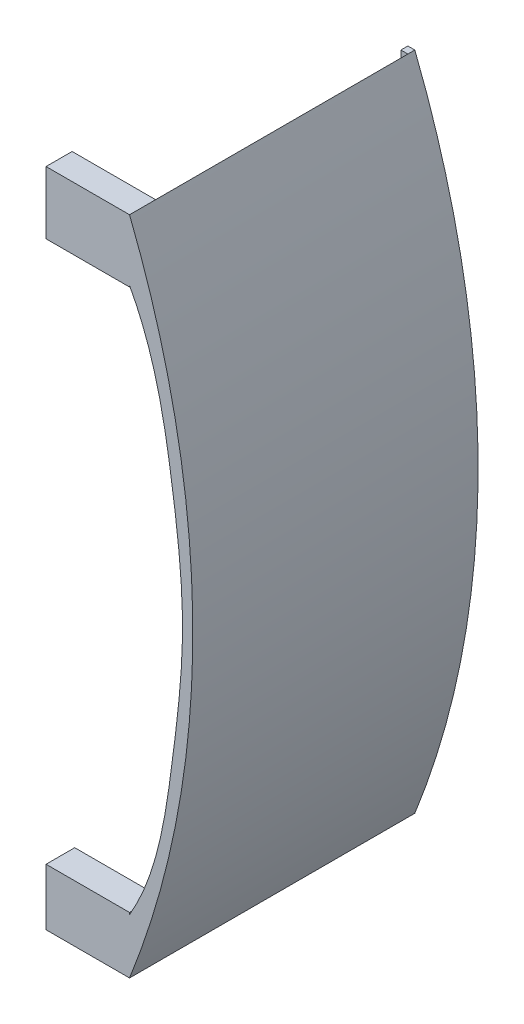
ISO-10303-21;
HEADER;
FILE_DESCRIPTION(('STEP AP214'),'2;1');
FILE_NAME('part.step','',(''),(''),'','','');
FILE_SCHEMA(('AUTOMOTIVE_DESIGN { 1 0 10303 214 1 1 1 1 }'));
ENDSEC;
DATA;
#1=APPLICATION_CONTEXT('core data for automotive mechanical design processes');
#2=APPLICATION_PROTOCOL_DEFINITION('international standard','automotive_design',2000,#1);
#3=PRODUCT_CONTEXT('',#1,'mechanical');
#4=PRODUCT('Part','Part','',(#3));
#5=PRODUCT_RELATED_PRODUCT_CATEGORY('part','',(#4));
#6=PRODUCT_DEFINITION_FORMATION('','',#4);
#7=PRODUCT_DEFINITION_CONTEXT('part definition',#1,'design');
#8=PRODUCT_DEFINITION('design','',#6,#7);
#9=PRODUCT_DEFINITION_SHAPE('','',#8);
#10=(LENGTH_UNIT() NAMED_UNIT(*) SI_UNIT(.MILLI.,.METRE.));
#11=(NAMED_UNIT(*) PLANE_ANGLE_UNIT() SI_UNIT($,.RADIAN.));
#12=(NAMED_UNIT(*) SI_UNIT($,.STERADIAN.) SOLID_ANGLE_UNIT());
#13=UNCERTAINTY_MEASURE_WITH_UNIT(LENGTH_MEASURE(1.E-05),#10,'distance_accuracy_value','');
#14=(GEOMETRIC_REPRESENTATION_CONTEXT(3) GLOBAL_UNCERTAINTY_ASSIGNED_CONTEXT((#13)) GLOBAL_UNIT_ASSIGNED_CONTEXT((#10,
#11,#12)) REPRESENTATION_CONTEXT('',''));
#15=CARTESIAN_POINT('',(0.,0.,0.));
#16=DIRECTION('',(0.,0.,1.));
#17=DIRECTION('',(1.,0.,0.));
#18=AXIS2_PLACEMENT_3D('',#15,#16,#17);
#19=CARTESIAN_POINT('',(0.,-95.,41.));
#20=DIRECTION('',(1.,0.,0.));
#21=DIRECTION('',(0.,1.,0.));
#22=AXIS2_PLACEMENT_3D('',#19,#20,#21);
#23=PLANE('',#22);
#24=DIRECTION('',(0.,1.,0.));
#25=VECTOR('',#24,1.);
#26=CARTESIAN_POINT('',(0.,95.,-39.));
#27=LINE('',#26,#25);
#28=CARTESIAN_POINT('',(0.,77.403954957847,-39.));
#29=VERTEX_POINT('',#28);
#30=CARTESIAN_POINT('',(0.,95.,-39.));
#31=VERTEX_POINT('',#30);
#32=EDGE_CURVE('E57',#29,#31,#27,.T.);
#33=ORIENTED_EDGE('',*,*,#32,.F.);
#34=DIRECTION('',(0.,0.,1.));
#35=VECTOR('',#34,1.);
#36=CARTESIAN_POINT('',(0.,77.403954957847,-41.));
#37=LINE('',#36,#35);
#38=CARTESIAN_POINT('',(0.,77.403954957847,33.5080196550556));
#39=VERTEX_POINT('',#38);
#40=EDGE_CURVE('E180',#29,#39,#37,.T.);
#41=ORIENTED_EDGE('',*,*,#40,.T.);
#42=DIRECTION('',(0.,-1.,0.));
#43=VECTOR('',#42,1.);
#44=CARTESIAN_POINT('',(0.,95.,33.5080196550556));
#45=LINE('',#44,#43);
#46=CARTESIAN_POINT('',(0.,95.,33.5080196550556));
#47=VERTEX_POINT('',#46);
#48=EDGE_CURVE('E334',#47,#39,#45,.T.);
#49=ORIENTED_EDGE('',*,*,#48,.F.);
#50=DIRECTION('',(0.,0.,-1.));
#51=VECTOR('',#50,1.);
#52=CARTESIAN_POINT('',(0.,95.,41.));
#53=LINE('',#52,#51);
#54=EDGE_CURVE('E42',#47,#31,#53,.T.);
#55=ORIENTED_EDGE('',*,*,#54,.T.);
#56=EDGE_LOOP('',(#33,#41,#49,#55));
#57=FACE_BOUND('',#56,.T.);
#58=ADVANCED_FACE('F34',(#57),#23,.F.);
#59=DIRECTION('',(0.,-1.,0.));
#60=VECTOR('',#59,1.);
#61=CARTESIAN_POINT('',(0.,-95.,32.7580196550556));
#62=LINE('',#61,#60);
#63=CARTESIAN_POINT('',(0.,-79.2331527558384,32.7580196550556));
#64=VERTEX_POINT('',#63);
#65=CARTESIAN_POINT('',(0.,-95.,32.7580196550556));
#66=VERTEX_POINT('',#65);
#67=EDGE_CURVE('E299',#64,#66,#62,.T.);
#68=ORIENTED_EDGE('',*,*,#67,.F.);
#69=DIRECTION('',(0.,0.,1.));
#70=VECTOR('',#69,1.);
#71=CARTESIAN_POINT('',(0.,-79.2331527558384,-41.));
#72=LINE('',#71,#70);
#73=CARTESIAN_POINT('',(0.,-79.2331527558384,-39.));
#74=VERTEX_POINT('',#73);
#75=EDGE_CURVE('E302',#74,#64,#72,.T.);
#76=ORIENTED_EDGE('',*,*,#75,.F.);
#77=DIRECTION('',(0.,1.,0.));
#78=VECTOR('',#77,1.);
#79=CARTESIAN_POINT('',(0.,-95.,-39.));
#80=LINE('',#79,#78);
#81=CARTESIAN_POINT('',(0.,-95.,-39.));
#82=VERTEX_POINT('',#81);
#83=EDGE_CURVE('E415',#82,#74,#80,.T.);
#84=ORIENTED_EDGE('',*,*,#83,.F.);
#85=DIRECTION('',(0.,0.,-1.));
#86=VECTOR('',#85,1.);
#87=CARTESIAN_POINT('',(0.,-95.,41.));
#88=LINE('',#87,#86);
#89=EDGE_CURVE('E305',#66,#82,#88,.T.);
#90=ORIENTED_EDGE('',*,*,#89,.F.);
#91=EDGE_LOOP('',(#68,#76,#84,#90));
#92=FACE_BOUND('',#91,.T.);
#93=ADVANCED_FACE('F287',(#92),#23,.F.);
#94=CARTESIAN_POINT('',(-238.988345174706,0.,41.));
#95=DIRECTION('',(0.,0.,-1.));
#96=DIRECTION('',(-1.,0.,0.));
#97=AXIS2_PLACEMENT_3D('',#94,#95,#96);
#98=CYLINDRICAL_SURFACE('',#97,257.177816168783);
#99=CARTESIAN_POINT('',(-238.988345174706,0.,-41.));
#100=DIRECTION('',(0.,0.,1.));
#101=DIRECTION('',(-1.,0.,0.));
#102=AXIS2_PLACEMENT_3D('',#99,#100,#101);
#103=CIRCLE('',#102,257.177816168783);
#104=CARTESIAN_POINT('',(0.,-95.,-41.));
#105=VERTEX_POINT('',#104);
#106=CARTESIAN_POINT('',(0.,95.,-41.));
#107=VERTEX_POINT('',#106);
#108=EDGE_CURVE('E359',#105,#107,#103,.T.);
#109=ORIENTED_EDGE('',*,*,#108,.T.);
#110=DIRECTION('',(0.,0.,-1.));
#111=VECTOR('',#110,1.);
#112=CARTESIAN_POINT('',(0.,95.,-39.));
#113=LINE('',#112,#111);
#114=EDGE_CURVE('E392',#31,#107,#113,.T.);
#115=ORIENTED_EDGE('',*,*,#114,.F.);
#116=ORIENTED_EDGE('',*,*,#54,.F.);
#117=CARTESIAN_POINT('',(0.,95.,41.));
#118=VERTEX_POINT('',#117);
#119=EDGE_CURVE('E11',#118,#47,#53,.T.);
#120=ORIENTED_EDGE('',*,*,#119,.F.);
#121=CARTESIAN_POINT('',(-238.988345174706,0.,41.));
#122=DIRECTION('',(0.,0.,1.));
#123=DIRECTION('',(-1.,0.,0.));
#124=AXIS2_PLACEMENT_3D('',#121,#122,#123);
#125=CIRCLE('',#124,257.177816168783);
#126=CARTESIAN_POINT('',(0.,-95.,41.));
#127=VERTEX_POINT('',#126);
#128=EDGE_CURVE('E362',#127,#118,#125,.T.);
#129=ORIENTED_EDGE('',*,*,#128,.F.);
#130=EDGE_CURVE('E365',#127,#66,#88,.T.);
#131=ORIENTED_EDGE('',*,*,#130,.T.);
#132=ORIENTED_EDGE('',*,*,#89,.T.);
#133=DIRECTION('',(0.,0.,-1.));
#134=VECTOR('',#133,1.);
#135=CARTESIAN_POINT('',(0.,-95.,-39.));
#136=LINE('',#135,#134);
#137=EDGE_CURVE('E371',#82,#105,#136,.T.);
#138=ORIENTED_EDGE('',*,*,#137,.T.);
#139=EDGE_LOOP('',(#109,#115,#116,#120,#129,#131,#132,#138));
#140=FACE_BOUND('',#139,.T.);
#141=ADVANCED_FACE('F36',(#140),#98,.T.);
#142=CARTESIAN_POINT('',(-238.988345174706,0.,41.));
#143=DIRECTION('',(0.,0.,-1.));
#144=DIRECTION('',(-1.,0.,0.));
#145=AXIS2_PLACEMENT_3D('',#142,#143,#144);
#146=PLANE('',#145);
#147=CARTESIAN_POINT('',(0.,-79.2331527558384,41.));
#148=CARTESIAN_POINT('',(8.09473103737131,-65.4560845804218,41.));
#149=CARTESIAN_POINT('',(12.0147305910402,-38.3103847513682,41.));
#150=CARTESIAN_POINT('',(16.5809048340559,-0.0417572838327915,41.));
#151=CARTESIAN_POINT('',(12.0698818166097,37.679146823226,41.));
#152=CARTESIAN_POINT('',(7.29967651003466,63.9991056083044,41.));
#153=CARTESIAN_POINT('',(0.,77.403954957847,41.));
#154=B_SPLINE_CURVE_WITH_KNOTS('',3,(#147,#148,#149,#150,#151,#152,#153),.UNSPECIFIED.,.F.,.F.,
(4,1,1,1,4),(0.,0.293310150467469,0.505853511654225,0.717729204315068,1.),.UNSPECIFIED.);
#155=CARTESIAN_POINT('',(0.,-79.2331527558384,41.));
#156=VERTEX_POINT('',#155);
#157=CARTESIAN_POINT('',(0.,77.403954957847,41.));
#158=VERTEX_POINT('',#157);
#159=EDGE_CURVE('E186',#156,#158,#154,.T.);
#160=ORIENTED_EDGE('',*,*,#159,.F.);
#161=DIRECTION('',(0.,-1.,0.));
#162=VECTOR('',#161,1.);
#163=CARTESIAN_POINT('',(0.,77.403954957847,41.));
#164=LINE('',#163,#162);
#165=CARTESIAN_POINT('',(0.,-78.6817419820309,41.));
#166=VERTEX_POINT('',#165);
#167=EDGE_CURVE('E192',#166,#156,#164,.T.);
#168=ORIENTED_EDGE('',*,*,#167,.F.);
#169=DIRECTION('',(1.,0.,0.));
#170=VECTOR('',#169,1.);
#171=CARTESIAN_POINT('',(-24.,-78.6817419820309,41.));
#172=LINE('',#171,#170);
#173=CARTESIAN_POINT('',(-24.,-78.6817419820309,41.));
#174=VERTEX_POINT('',#173);
#175=EDGE_CURVE('E331',#174,#166,#172,.T.);
#176=ORIENTED_EDGE('',*,*,#175,.F.);
#177=DIRECTION('',(0.,1.,0.));
#178=VECTOR('',#177,1.);
#179=CARTESIAN_POINT('',(-24.,-95.,41.));
#180=LINE('',#179,#178);
#181=CARTESIAN_POINT('',(-24.,-95.,41.));
#182=VERTEX_POINT('',#181);
#183=EDGE_CURVE('E318',#182,#174,#180,.T.);
#184=ORIENTED_EDGE('',*,*,#183,.F.);
#185=DIRECTION('',(1.,0.,0.));
#186=VECTOR('',#185,1.);
#187=CARTESIAN_POINT('',(-24.,-95.,41.));
#188=LINE('',#187,#186);
#189=EDGE_CURVE('E325',#182,#127,#188,.T.);
#190=ORIENTED_EDGE('',*,*,#189,.T.);
#191=ORIENTED_EDGE('',*,*,#128,.T.);
#192=DIRECTION('',(1.,0.,0.));
#193=VECTOR('',#192,1.);
#194=CARTESIAN_POINT('',(-24.,95.,41.));
#195=LINE('',#194,#193);
#196=CARTESIAN_POINT('',(-24.,95.,41.));
#197=VERTEX_POINT('',#196);
#198=EDGE_CURVE('E355',#197,#118,#195,.T.);
#199=ORIENTED_EDGE('',*,*,#198,.F.);
#200=DIRECTION('',(0.,1.,0.));
#201=VECTOR('',#200,1.);
#202=CARTESIAN_POINT('',(-24.,95.,41.));
#203=LINE('',#202,#201);
#204=CARTESIAN_POINT('',(-24.,77.,41.));
#205=VERTEX_POINT('',#204);
#206=EDGE_CURVE('E335',#205,#197,#203,.T.);
#207=ORIENTED_EDGE('',*,*,#206,.F.);
#208=DIRECTION('',(1.,0.,0.));
#209=VECTOR('',#208,1.);
#210=CARTESIAN_POINT('',(-24.,77.,41.));
#211=LINE('',#210,#209);
#212=CARTESIAN_POINT('',(0.,77.,41.));
#213=VERTEX_POINT('',#212);
#214=EDGE_CURVE('E197',#205,#213,#211,.T.);
#215=ORIENTED_EDGE('',*,*,#214,.T.);
#216=EDGE_CURVE('E174',#158,#213,#164,.T.);
#217=ORIENTED_EDGE('',*,*,#216,.F.);
#218=EDGE_LOOP('',(#160,#168,#176,#184,#190,#191,#199,#207,#215,#217));
#219=FACE_BOUND('',#218,.T.);
#220=ADVANCED_FACE('F194',(#219),#146,.F.);
#221=CARTESIAN_POINT('',(-238.988345174706,0.,-41.));
#222=DIRECTION('',(0.,0.,-1.));
#223=DIRECTION('',(-1.,0.,0.));
#224=AXIS2_PLACEMENT_3D('',#221,#222,#223);
#225=PLANE('',#224);
#226=DIRECTION('',(0.,-1.,0.));
#227=VECTOR('',#226,1.);
#228=CARTESIAN_POINT('',(0.,77.403954957847,-41.));
#229=LINE('',#228,#227);
#230=CARTESIAN_POINT('',(0.,-75.9354333613668,-41.));
#231=VERTEX_POINT('',#230);
#232=CARTESIAN_POINT('',(0.,-79.2331527558384,-41.));
#233=VERTEX_POINT('',#232);
#234=EDGE_CURVE('E202',#231,#233,#229,.T.);
#235=ORIENTED_EDGE('',*,*,#234,.T.);
#236=CARTESIAN_POINT('',(0.,-79.2331527558384,-41.));
#237=CARTESIAN_POINT('',(8.09473103737131,-65.4560845804218,-41.));
#238=CARTESIAN_POINT('',(12.0147305910402,-38.3103847513682,-41.));
#239=CARTESIAN_POINT('',(16.5809048340559,-0.0417572838327915,-41.));
#240=CARTESIAN_POINT('',(12.0698818166097,37.679146823226,-41.));
#241=CARTESIAN_POINT('',(7.29967651003466,63.9991056083044,-41.));
#242=CARTESIAN_POINT('',(0.,77.403954957847,-41.));
#243=B_SPLINE_CURVE_WITH_KNOTS('',3,(#236,#237,#238,#239,#240,#241,#242),.UNSPECIFIED.,.F.,.F.,
(4,1,1,1,4),(0.,0.293310150467469,0.505853511654225,0.717729204315068,1.),.UNSPECIFIED.);
#244=CARTESIAN_POINT('',(0.,77.403954957847,-41.));
#245=VERTEX_POINT('',#244);
#246=EDGE_CURVE('E199',#233,#245,#243,.T.);
#247=ORIENTED_EDGE('',*,*,#246,.T.);
#248=CARTESIAN_POINT('',(0.,73.1891247407023,-41.));
#249=VERTEX_POINT('',#248);
#250=EDGE_CURVE('E181',#245,#249,#229,.T.);
#251=ORIENTED_EDGE('',*,*,#250,.T.);
#252=DIRECTION('',(1.,0.,0.));
#253=VECTOR('',#252,1.);
#254=CARTESIAN_POINT('',(0.,73.1891247407023,-41.));
#255=LINE('',#254,#253);
#256=CARTESIAN_POINT('',(-2.00000000000003,73.1891247407023,-41.));
#257=VERTEX_POINT('',#256);
#258=EDGE_CURVE('E440',#257,#249,#255,.T.);
#259=ORIENTED_EDGE('',*,*,#258,.F.);
#260=DIRECTION('',(0.,-1.,0.));
#261=VECTOR('',#260,1.);
#262=CARTESIAN_POINT('',(-2.00000000000003,95.,-41.));
#263=LINE('',#262,#261);
#264=CARTESIAN_POINT('',(-2.00000000000003,95.,-41.));
#265=VERTEX_POINT('',#264);
#266=EDGE_CURVE('E386',#265,#257,#263,.T.);
#267=ORIENTED_EDGE('',*,*,#266,.F.);
#268=DIRECTION('',(-1.,0.,0.));
#269=VECTOR('',#268,1.);
#270=CARTESIAN_POINT('',(0.,95.,-41.));
#271=LINE('',#270,#269);
#272=EDGE_CURVE('E383',#107,#265,#271,.T.);
#273=ORIENTED_EDGE('',*,*,#272,.F.);
#274=ORIENTED_EDGE('',*,*,#108,.F.);
#275=DIRECTION('',(1.,0.,0.));
#276=VECTOR('',#275,1.);
#277=CARTESIAN_POINT('',(0.,-95.,-41.));
#278=LINE('',#277,#276);
#279=CARTESIAN_POINT('',(-2.,-95.,-41.));
#280=VERTEX_POINT('',#279);
#281=EDGE_CURVE('E381',#280,#105,#278,.T.);
#282=ORIENTED_EDGE('',*,*,#281,.F.);
#283=DIRECTION('',(0.,-1.,0.));
#284=VECTOR('',#283,1.);
#285=CARTESIAN_POINT('',(-2.,-95.,-41.));
#286=LINE('',#285,#284);
#287=CARTESIAN_POINT('',(-2.,-75.9354333613668,-41.));
#288=VERTEX_POINT('',#287);
#289=EDGE_CURVE('E424',#288,#280,#286,.T.);
#290=ORIENTED_EDGE('',*,*,#289,.F.);
#291=DIRECTION('',(-1.,0.,0.));
#292=VECTOR('',#291,1.);
#293=CARTESIAN_POINT('',(0.,-75.9354333613668,-41.));
#294=LINE('',#293,#292);
#295=EDGE_CURVE('E414',#231,#288,#294,.T.);
#296=ORIENTED_EDGE('',*,*,#295,.F.);
#297=EDGE_LOOP('',(#235,#247,#251,#259,#267,#273,#274,#282,#290,#296));
#298=FACE_BOUND('',#297,.T.);
#299=ADVANCED_FACE('F281',(#298),#225,.T.);
#300=CARTESIAN_POINT('',(-24.,95.,41.));
#301=DIRECTION('',(0.,-1.,0.));
#302=DIRECTION('',(1.,0.,0.));
#303=AXIS2_PLACEMENT_3D('',#300,#301,#302);
#304=PLANE('',#303);
#305=ORIENTED_EDGE('',*,*,#119,.T.);
#306=DIRECTION('',(1.,0.,0.));
#307=VECTOR('',#306,1.);
#308=CARTESIAN_POINT('',(-24.,95.,33.5080196550556));
#309=LINE('',#308,#307);
#310=CARTESIAN_POINT('',(-24.,95.,33.5080196550556));
#311=VERTEX_POINT('',#310);
#312=EDGE_CURVE('E352',#311,#47,#309,.T.);
#313=ORIENTED_EDGE('',*,*,#312,.F.);
#314=DIRECTION('',(0.,0.,-1.));
#315=VECTOR('',#314,1.);
#316=CARTESIAN_POINT('',(-24.,95.,41.));
#317=LINE('',#316,#315);
#318=EDGE_CURVE('E338',#197,#311,#317,.T.);
#319=ORIENTED_EDGE('',*,*,#318,.F.);
#320=ORIENTED_EDGE('',*,*,#198,.T.);
#321=EDGE_LOOP('',(#305,#313,#319,#320));
#322=FACE_BOUND('',#321,.T.);
#323=ADVANCED_FACE('F277',(#322),#304,.F.);
#324=CARTESIAN_POINT('',(-24.,95.,33.5080196550556));
#325=DIRECTION('',(0.,0.,1.));
#326=DIRECTION('',(1.,0.,0.));
#327=AXIS2_PLACEMENT_3D('',#324,#325,#326);
#328=PLANE('',#327);
#329=ORIENTED_EDGE('',*,*,#48,.T.);
#330=DIRECTION('',(0.,-1.,0.));
#331=VECTOR('',#330,1.);
#332=CARTESIAN_POINT('',(0.,95.,33.5080196550556));
#333=LINE('',#332,#331);
#334=CARTESIAN_POINT('',(0.,77.,33.5080196550556));
#335=VERTEX_POINT('',#334);
#336=EDGE_CURVE('E177',#39,#335,#333,.T.);
#337=ORIENTED_EDGE('',*,*,#336,.T.);
#338=DIRECTION('',(1.,0.,0.));
#339=VECTOR('',#338,1.);
#340=CARTESIAN_POINT('',(-24.,77.,33.5080196550556));
#341=LINE('',#340,#339);
#342=CARTESIAN_POINT('',(-24.,77.,33.5080196550556));
#343=VERTEX_POINT('',#342);
#344=EDGE_CURVE('E349',#343,#335,#341,.T.);
#345=ORIENTED_EDGE('',*,*,#344,.F.);
#346=DIRECTION('',(0.,-1.,0.));
#347=VECTOR('',#346,1.);
#348=CARTESIAN_POINT('',(-24.,95.,33.5080196550556));
#349=LINE('',#348,#347);
#350=EDGE_CURVE('E341',#311,#343,#349,.T.);
#351=ORIENTED_EDGE('',*,*,#350,.F.);
#352=ORIENTED_EDGE('',*,*,#312,.T.);
#353=EDGE_LOOP('',(#329,#337,#345,#351,#352));
#354=FACE_BOUND('',#353,.T.);
#355=ADVANCED_FACE('F273',(#354),#328,.F.);
#356=CARTESIAN_POINT('',(-24.,77.,41.));
#357=DIRECTION('',(0.,1.,0.));
#358=DIRECTION('',(-1.,0.,0.));
#359=AXIS2_PLACEMENT_3D('',#356,#357,#358);
#360=PLANE('',#359);
#361=DIRECTION('',(0.,0.,1.));
#362=VECTOR('',#361,1.);
#363=CARTESIAN_POINT('',(0.,77.,41.));
#364=LINE('',#363,#362);
#365=EDGE_CURVE('E339',#335,#213,#364,.T.);
#366=ORIENTED_EDGE('',*,*,#365,.T.);
#367=ORIENTED_EDGE('',*,*,#214,.F.);
#368=DIRECTION('',(0.,0.,1.));
#369=VECTOR('',#368,1.);
#370=CARTESIAN_POINT('',(-24.,77.,41.));
#371=LINE('',#370,#369);
#372=EDGE_CURVE('E343',#343,#205,#371,.T.);
#373=ORIENTED_EDGE('',*,*,#372,.F.);
#374=ORIENTED_EDGE('',*,*,#344,.T.);
#375=EDGE_LOOP('',(#366,#367,#373,#374));
#376=FACE_BOUND('',#375,.T.);
#377=ADVANCED_FACE('F269',(#376),#360,.F.);
#378=CARTESIAN_POINT('',(-24.,0.,0.));
#379=DIRECTION('',(1.,0.,0.));
#380=DIRECTION('',(0.,1.,0.));
#381=AXIS2_PLACEMENT_3D('',#378,#379,#380);
#382=PLANE('',#381);
#383=ORIENTED_EDGE('',*,*,#206,.T.);
#384=ORIENTED_EDGE('',*,*,#318,.T.);
#385=ORIENTED_EDGE('',*,*,#350,.T.);
#386=ORIENTED_EDGE('',*,*,#372,.T.);
#387=EDGE_LOOP('',(#383,#384,#385,#386));
#388=FACE_BOUND('',#387,.T.);
#389=ADVANCED_FACE('F265',(#388),#382,.F.);
#390=CARTESIAN_POINT('',(-24.,-78.6817419820309,41.));
#391=DIRECTION('',(0.,-1.,0.));
#392=DIRECTION('',(1.,0.,0.));
#393=AXIS2_PLACEMENT_3D('',#390,#391,#392);
#394=PLANE('',#393);
#395=DIRECTION('',(0.,0.,-1.));
#396=VECTOR('',#395,1.);
#397=CARTESIAN_POINT('',(0.,-78.6817419820309,41.));
#398=LINE('',#397,#396);
#399=CARTESIAN_POINT('',(0.,-78.6817419820309,32.7580196550556));
#400=VERTEX_POINT('',#399);
#401=EDGE_CURVE('E310',#166,#400,#398,.T.);
#402=ORIENTED_EDGE('',*,*,#401,.T.);
#403=DIRECTION('',(1.,0.,0.));
#404=VECTOR('',#403,1.);
#405=CARTESIAN_POINT('',(-24.,-78.6817419820309,32.7580196550556));
#406=LINE('',#405,#404);
#407=CARTESIAN_POINT('',(-24.,-78.6817419820309,32.7580196550556));
#408=VERTEX_POINT('',#407);
#409=EDGE_CURVE('E315',#408,#400,#406,.T.);
#410=ORIENTED_EDGE('',*,*,#409,.F.);
#411=DIRECTION('',(0.,0.,-1.));
#412=VECTOR('',#411,1.);
#413=CARTESIAN_POINT('',(-24.,-78.6817419820309,41.));
#414=LINE('',#413,#412);
#415=EDGE_CURVE('E320',#174,#408,#414,.T.);
#416=ORIENTED_EDGE('',*,*,#415,.F.);
#417=ORIENTED_EDGE('',*,*,#175,.T.);
#418=EDGE_LOOP('',(#402,#410,#416,#417));
#419=FACE_BOUND('',#418,.T.);
#420=ADVANCED_FACE('F261',(#419),#394,.F.);
#421=CARTESIAN_POINT('',(-24.,-95.,32.7580196550556));
#422=DIRECTION('',(0.,0.,1.));
#423=DIRECTION('',(1.,0.,0.));
#424=AXIS2_PLACEMENT_3D('',#421,#422,#423);
#425=PLANE('',#424);
#426=EDGE_CURVE('E309',#400,#64,#62,.T.);
#427=ORIENTED_EDGE('',*,*,#426,.T.);
#428=ORIENTED_EDGE('',*,*,#67,.T.);
#429=DIRECTION('',(1.,0.,0.));
#430=VECTOR('',#429,1.);
#431=CARTESIAN_POINT('',(-24.,-95.,32.7580196550556));
#432=LINE('',#431,#430);
#433=CARTESIAN_POINT('',(-24.,-95.,32.7580196550556));
#434=VERTEX_POINT('',#433);
#435=EDGE_CURVE('E327',#434,#66,#432,.T.);
#436=ORIENTED_EDGE('',*,*,#435,.F.);
#437=DIRECTION('',(0.,-1.,0.));
#438=VECTOR('',#437,1.);
#439=CARTESIAN_POINT('',(-24.,-95.,32.7580196550556));
#440=LINE('',#439,#438);
#441=EDGE_CURVE('E402',#408,#434,#440,.T.);
#442=ORIENTED_EDGE('',*,*,#441,.F.);
#443=ORIENTED_EDGE('',*,*,#409,.T.);
#444=EDGE_LOOP('',(#427,#428,#436,#442,#443));
#445=FACE_BOUND('',#444,.T.);
#446=ADVANCED_FACE('F257',(#445),#425,.F.);
#447=CARTESIAN_POINT('',(-24.,-95.,41.));
#448=DIRECTION('',(0.,1.,0.));
#449=DIRECTION('',(-1.,0.,0.));
#450=AXIS2_PLACEMENT_3D('',#447,#448,#449);
#451=PLANE('',#450);
#452=ORIENTED_EDGE('',*,*,#130,.F.);
#453=ORIENTED_EDGE('',*,*,#189,.F.);
#454=DIRECTION('',(0.,0.,1.));
#455=VECTOR('',#454,1.);
#456=CARTESIAN_POINT('',(-24.,-95.,41.));
#457=LINE('',#456,#455);
#458=EDGE_CURVE('E328',#434,#182,#457,.T.);
#459=ORIENTED_EDGE('',*,*,#458,.F.);
#460=ORIENTED_EDGE('',*,*,#435,.T.);
#461=EDGE_LOOP('',(#452,#453,#459,#460));
#462=FACE_BOUND('',#461,.T.);
#463=ADVANCED_FACE('F253',(#462),#451,.F.);
#464=CARTESIAN_POINT('',(-24.,0.,0.));
#465=DIRECTION('',(-1.,0.,0.));
#466=DIRECTION('',(0.,-1.,0.));
#467=AXIS2_PLACEMENT_3D('',#464,#465,#466);
#468=PLANE('',#467);
#469=ORIENTED_EDGE('',*,*,#183,.T.);
#470=ORIENTED_EDGE('',*,*,#415,.T.);
#471=ORIENTED_EDGE('',*,*,#441,.T.);
#472=ORIENTED_EDGE('',*,*,#458,.T.);
#473=EDGE_LOOP('',(#469,#470,#471,#472));
#474=FACE_BOUND('',#473,.T.);
#475=ADVANCED_FACE('F249',(#474),#468,.T.);
#476=CARTESIAN_POINT('',(0.,95.,-39.));
#477=DIRECTION('',(0.,-1.,0.));
#478=DIRECTION('',(0.,0.,-1.));
#479=AXIS2_PLACEMENT_3D('',#476,#477,#478);
#480=PLANE('',#479);
#481=ORIENTED_EDGE('',*,*,#272,.T.);
#482=DIRECTION('',(0.,0.,-1.));
#483=VECTOR('',#482,1.);
#484=CARTESIAN_POINT('',(-2.00000000000003,95.,-39.));
#485=LINE('',#484,#483);
#486=CARTESIAN_POINT('',(-2.00000000000003,95.,-39.));
#487=VERTEX_POINT('',#486);
#488=EDGE_CURVE('E395',#487,#265,#485,.T.);
#489=ORIENTED_EDGE('',*,*,#488,.F.);
#490=DIRECTION('',(-1.,0.,0.));
#491=VECTOR('',#490,1.);
#492=CARTESIAN_POINT('',(0.,95.,-39.));
#493=LINE('',#492,#491);
#494=EDGE_CURVE('E393',#31,#487,#493,.T.);
#495=ORIENTED_EDGE('',*,*,#494,.F.);
#496=ORIENTED_EDGE('',*,*,#114,.T.);
#497=EDGE_LOOP('',(#481,#489,#495,#496));
#498=FACE_BOUND('',#497,.T.);
#499=ADVANCED_FACE('F245',(#498),#480,.F.);
#500=CARTESIAN_POINT('',(-2.00000000000003,95.,-39.));
#501=DIRECTION('',(1.,0.,0.));
#502=DIRECTION('',(0.,1.,0.));
#503=AXIS2_PLACEMENT_3D('',#500,#501,#502);
#504=PLANE('',#503);
#505=ORIENTED_EDGE('',*,*,#266,.T.);
#506=DIRECTION('',(0.,0.,-1.));
#507=VECTOR('',#506,1.);
#508=CARTESIAN_POINT('',(-2.00000000000003,73.1891247407023,-39.));
#509=LINE('',#508,#507);
#510=CARTESIAN_POINT('',(-2.00000000000003,73.1891247407023,-39.));
#511=VERTEX_POINT('',#510);
#512=EDGE_CURVE('E397',#511,#257,#509,.T.);
#513=ORIENTED_EDGE('',*,*,#512,.F.);
#514=DIRECTION('',(0.,-1.,0.));
#515=VECTOR('',#514,1.);
#516=CARTESIAN_POINT('',(-2.00000000000003,95.,-39.));
#517=LINE('',#516,#515);
#518=EDGE_CURVE('E434',#487,#511,#517,.T.);
#519=ORIENTED_EDGE('',*,*,#518,.F.);
#520=ORIENTED_EDGE('',*,*,#488,.T.);
#521=EDGE_LOOP('',(#505,#513,#519,#520));
#522=FACE_BOUND('',#521,.T.);
#523=ADVANCED_FACE('F241',(#522),#504,.F.);
#524=CARTESIAN_POINT('',(0.,73.1891247407023,-39.));
#525=DIRECTION('',(0.,1.,0.));
#526=DIRECTION('',(0.,0.,1.));
#527=AXIS2_PLACEMENT_3D('',#524,#525,#526);
#528=PLANE('',#527);
#529=ORIENTED_EDGE('',*,*,#258,.T.);
#530=DIRECTION('',(0.,0.,1.));
#531=VECTOR('',#530,1.);
#532=CARTESIAN_POINT('',(0.,73.1891247407023,-41.));
#533=LINE('',#532,#531);
#534=CARTESIAN_POINT('',(0.,73.1891247407023,-39.));
#535=VERTEX_POINT('',#534);
#536=EDGE_CURVE('E357',#249,#535,#533,.T.);
#537=ORIENTED_EDGE('',*,*,#536,.T.);
#538=DIRECTION('',(1.,0.,0.));
#539=VECTOR('',#538,1.);
#540=CARTESIAN_POINT('',(0.,73.1891247407023,-39.));
#541=LINE('',#540,#539);
#542=EDGE_CURVE('E436',#511,#535,#541,.T.);
#543=ORIENTED_EDGE('',*,*,#542,.F.);
#544=ORIENTED_EDGE('',*,*,#512,.T.);
#545=EDGE_LOOP('',(#529,#537,#543,#544));
#546=FACE_BOUND('',#545,.T.);
#547=ADVANCED_FACE('F238',(#546),#528,.F.);
#548=CARTESIAN_POINT('',(0.,0.,-39.));
#549=DIRECTION('',(0.,0.,-1.));
#550=DIRECTION('',(-1.,0.,0.));
#551=AXIS2_PLACEMENT_3D('',#548,#549,#550);
#552=PLANE('',#551);
#553=EDGE_CURVE('E431',#535,#29,#27,.T.);
#554=ORIENTED_EDGE('',*,*,#553,.T.);
#555=ORIENTED_EDGE('',*,*,#32,.T.);
#556=ORIENTED_EDGE('',*,*,#494,.T.);
#557=ORIENTED_EDGE('',*,*,#518,.T.);
#558=ORIENTED_EDGE('',*,*,#542,.T.);
#559=EDGE_LOOP('',(#554,#555,#556,#557,#558));
#560=FACE_BOUND('',#559,.T.);
#561=ADVANCED_FACE('F234',(#560),#552,.F.);
#562=CARTESIAN_POINT('',(0.,-75.9354333613668,-39.));
#563=DIRECTION('',(0.,-1.,0.));
#564=DIRECTION('',(0.,0.,-1.));
#565=AXIS2_PLACEMENT_3D('',#562,#563,#564);
#566=PLANE('',#565);
#567=ORIENTED_EDGE('',*,*,#295,.T.);
#568=DIRECTION('',(0.,0.,-1.));
#569=VECTOR('',#568,1.);
#570=CARTESIAN_POINT('',(-2.,-75.9354333613668,-39.));
#571=LINE('',#570,#569);
#572=CARTESIAN_POINT('',(-2.,-75.9354333613668,-39.));
#573=VERTEX_POINT('',#572);
#574=EDGE_CURVE('E389',#573,#288,#571,.T.);
#575=ORIENTED_EDGE('',*,*,#574,.F.);
#576=DIRECTION('',(-1.,0.,0.));
#577=VECTOR('',#576,1.);
#578=CARTESIAN_POINT('',(0.,-75.9354333613668,-39.));
#579=LINE('',#578,#577);
#580=CARTESIAN_POINT('',(0.,-75.9354333613668,-39.));
#581=VERTEX_POINT('',#580);
#582=EDGE_CURVE('E417',#581,#573,#579,.T.);
#583=ORIENTED_EDGE('',*,*,#582,.F.);
#584=DIRECTION('',(0.,0.,1.));
#585=VECTOR('',#584,1.);
#586=CARTESIAN_POINT('',(0.,-75.9354333613668,-41.));
#587=LINE('',#586,#585);
#588=EDGE_CURVE('E49',#231,#581,#587,.T.);
#589=ORIENTED_EDGE('',*,*,#588,.F.);
#590=EDGE_LOOP('',(#567,#575,#583,#589));
#591=FACE_BOUND('',#590,.T.);
#592=ADVANCED_FACE('F230',(#591),#566,.F.);
#593=CARTESIAN_POINT('',(-2.,-95.,-39.));
#594=DIRECTION('',(1.,0.,0.));
#595=DIRECTION('',(0.,0.,-1.));
#596=AXIS2_PLACEMENT_3D('',#593,#594,#595);
#597=PLANE('',#596);
#598=ORIENTED_EDGE('',*,*,#289,.T.);
#599=DIRECTION('',(0.,0.,-1.));
#600=VECTOR('',#599,1.);
#601=CARTESIAN_POINT('',(-2.,-95.,-39.));
#602=LINE('',#601,#600);
#603=CARTESIAN_POINT('',(-2.,-95.,-39.));
#604=VERTEX_POINT('',#603);
#605=EDGE_CURVE('E375',#604,#280,#602,.T.);
#606=ORIENTED_EDGE('',*,*,#605,.F.);
#607=DIRECTION('',(0.,-1.,0.));
#608=VECTOR('',#607,1.);
#609=CARTESIAN_POINT('',(-2.,-95.,-39.));
#610=LINE('',#609,#608);
#611=EDGE_CURVE('E420',#573,#604,#610,.T.);
#612=ORIENTED_EDGE('',*,*,#611,.F.);
#613=ORIENTED_EDGE('',*,*,#574,.T.);
#614=EDGE_LOOP('',(#598,#606,#612,#613));
#615=FACE_BOUND('',#614,.T.);
#616=ADVANCED_FACE('F226',(#615),#597,.F.);
#617=CARTESIAN_POINT('',(0.,-95.,-39.));
#618=DIRECTION('',(0.,1.,0.));
#619=DIRECTION('',(0.,0.,1.));
#620=AXIS2_PLACEMENT_3D('',#617,#618,#619);
#621=PLANE('',#620);
#622=ORIENTED_EDGE('',*,*,#281,.T.);
#623=ORIENTED_EDGE('',*,*,#137,.F.);
#624=DIRECTION('',(1.,0.,0.));
#625=VECTOR('',#624,1.);
#626=CARTESIAN_POINT('',(0.,-95.,-39.));
#627=LINE('',#626,#625);
#628=EDGE_CURVE('E376',#604,#82,#627,.T.);
#629=ORIENTED_EDGE('',*,*,#628,.F.);
#630=ORIENTED_EDGE('',*,*,#605,.T.);
#631=EDGE_LOOP('',(#622,#623,#629,#630));
#632=FACE_BOUND('',#631,.T.);
#633=ADVANCED_FACE('F222',(#632),#621,.F.);
#634=CARTESIAN_POINT('',(0.,0.,-39.));
#635=DIRECTION('',(0.,0.,1.));
#636=DIRECTION('',(1.,0.,0.));
#637=AXIS2_PLACEMENT_3D('',#634,#635,#636);
#638=PLANE('',#637);
#639=ORIENTED_EDGE('',*,*,#83,.T.);
#640=EDGE_CURVE('E418',#74,#581,#80,.T.);
#641=ORIENTED_EDGE('',*,*,#640,.T.);
#642=ORIENTED_EDGE('',*,*,#582,.T.);
#643=ORIENTED_EDGE('',*,*,#611,.T.);
#644=ORIENTED_EDGE('',*,*,#628,.T.);
#645=EDGE_LOOP('',(#639,#641,#642,#643,#644));
#646=FACE_BOUND('',#645,.T.);
#647=ADVANCED_FACE('F219',(#646),#638,.T.);
#648=CARTESIAN_POINT('',(0.,77.403954957847,-41.));
#649=DIRECTION('',(-1.,0.,0.));
#650=DIRECTION('',(0.,0.,1.));
#651=AXIS2_PLACEMENT_3D('',#648,#649,#650);
#652=PLANE('',#651);
#653=EDGE_CURVE('E170',#39,#158,#37,.T.);
#654=ORIENTED_EDGE('',*,*,#653,.T.);
#655=ORIENTED_EDGE('',*,*,#216,.T.);
#656=ORIENTED_EDGE('',*,*,#365,.F.);
#657=ORIENTED_EDGE('',*,*,#336,.F.);
#658=EDGE_LOOP('',(#654,#655,#656,#657));
#659=FACE_BOUND('',#658,.T.);
#660=ADVANCED_FACE('F172',(#659),#652,.F.);
#661=ORIENTED_EDGE('',*,*,#167,.T.);
#662=EDGE_CURVE('E189',#64,#156,#72,.T.);
#663=ORIENTED_EDGE('',*,*,#662,.F.);
#664=ORIENTED_EDGE('',*,*,#426,.F.);
#665=ORIENTED_EDGE('',*,*,#401,.F.);
#666=EDGE_LOOP('',(#661,#663,#664,#665));
#667=FACE_BOUND('',#666,.T.);
#668=ADVANCED_FACE('F407',(#667),#652,.F.);
#669=ORIENTED_EDGE('',*,*,#250,.F.);
#670=EDGE_CURVE('E183',#245,#29,#37,.T.);
#671=ORIENTED_EDGE('',*,*,#670,.T.);
#672=ORIENTED_EDGE('',*,*,#553,.F.);
#673=ORIENTED_EDGE('',*,*,#536,.F.);
#674=EDGE_LOOP('',(#669,#671,#672,#673));
#675=FACE_BOUND('',#674,.T.);
#676=ADVANCED_FACE('F450',(#675),#652,.F.);
#677=ORIENTED_EDGE('',*,*,#640,.F.);
#678=EDGE_CURVE('E408',#233,#74,#72,.T.);
#679=ORIENTED_EDGE('',*,*,#678,.F.);
#680=ORIENTED_EDGE('',*,*,#234,.F.);
#681=ORIENTED_EDGE('',*,*,#588,.T.);
#682=EDGE_LOOP('',(#677,#679,#680,#681));
#683=FACE_BOUND('',#682,.T.);
#684=ADVANCED_FACE('F218',(#683),#652,.F.);
#685=DIRECTION('',(0.,0.,1.));
#686=VECTOR('',#685,1.);
#687=SURFACE_OF_LINEAR_EXTRUSION('',#243,#686);
#688=ORIENTED_EDGE('',*,*,#670,.F.);
#689=ORIENTED_EDGE('',*,*,#246,.F.);
#690=ORIENTED_EDGE('',*,*,#678,.T.);
#691=ORIENTED_EDGE('',*,*,#75,.T.);
#692=ORIENTED_EDGE('',*,*,#662,.T.);
#693=ORIENTED_EDGE('',*,*,#159,.T.);
#694=ORIENTED_EDGE('',*,*,#653,.F.);
#695=ORIENTED_EDGE('',*,*,#40,.F.);
#696=EDGE_LOOP('',(#688,#689,#690,#691,#692,#693,#694,#695));
#697=FACE_BOUND('',#696,.T.);
#698=ADVANCED_FACE('F187',(#697),#687,.F.);
#699=CLOSED_SHELL('',(#58,#93,#141,#220,#299,#323,#355,#377,#389,#420,#446,#463,#475,#499,#523,
#547,#561,#592,#616,#633,#647,#660,#668,#676,#684,#698));
#700=MANIFOLD_SOLID_BREP('B2',#699);
#701=ADVANCED_BREP_SHAPE_REPRESENTATION('',(#18,#700),#14);
#702=SHAPE_DEFINITION_REPRESENTATION(#9,#701);
ENDSEC;
END-ISO-10303-21;
